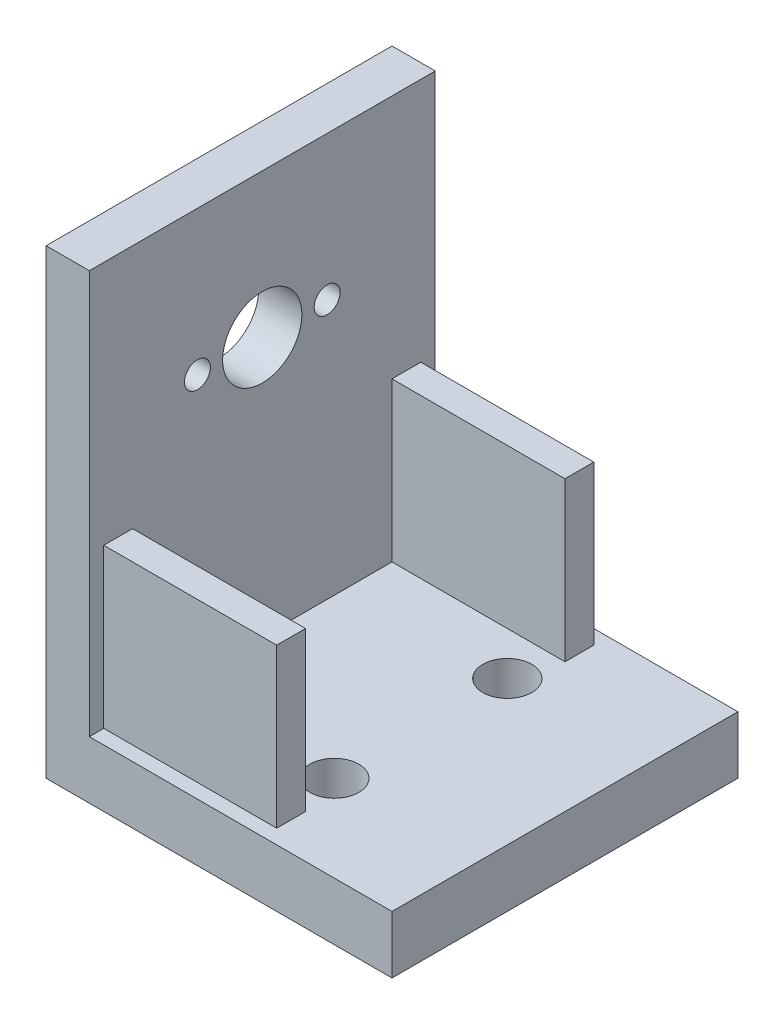
ISO-10303-21;
HEADER;
FILE_DESCRIPTION(('STEP AP214'),'2;1');
FILE_NAME('part.step','',(''),(''),'','','');
FILE_SCHEMA(('AUTOMOTIVE_DESIGN { 1 0 10303 214 1 1 1 1 }'));
ENDSEC;
DATA;
#1=APPLICATION_CONTEXT('core data for automotive mechanical design processes');
#2=APPLICATION_PROTOCOL_DEFINITION('international standard','automotive_design',2000,#1);
#3=PRODUCT_CONTEXT('',#1,'mechanical');
#4=PRODUCT('Part','Part','',(#3));
#5=PRODUCT_RELATED_PRODUCT_CATEGORY('part','',(#4));
#6=PRODUCT_DEFINITION_FORMATION('','',#4);
#7=PRODUCT_DEFINITION_CONTEXT('part definition',#1,'design');
#8=PRODUCT_DEFINITION('design','',#6,#7);
#9=PRODUCT_DEFINITION_SHAPE('','',#8);
#10=(LENGTH_UNIT() NAMED_UNIT(*) SI_UNIT(.MILLI.,.METRE.));
#11=(NAMED_UNIT(*) PLANE_ANGLE_UNIT() SI_UNIT($,.RADIAN.));
#12=(NAMED_UNIT(*) SI_UNIT($,.STERADIAN.) SOLID_ANGLE_UNIT());
#13=UNCERTAINTY_MEASURE_WITH_UNIT(LENGTH_MEASURE(1.E-05),#10,'distance_accuracy_value','');
#14=(GEOMETRIC_REPRESENTATION_CONTEXT(3) GLOBAL_UNCERTAINTY_ASSIGNED_CONTEXT((#13)) GLOBAL_UNIT_ASSIGNED_CONTEXT((#10,
#11,#12)) REPRESENTATION_CONTEXT('',''));
#15=CARTESIAN_POINT('',(0.,0.,0.));
#16=DIRECTION('',(0.,0.,1.));
#17=DIRECTION('',(1.,0.,0.));
#18=AXIS2_PLACEMENT_3D('',#15,#16,#17);
#19=CARTESIAN_POINT('',(0.,4.,0.));
#20=DIRECTION('',(0.,-1.,0.));
#21=DIRECTION('',(0.,0.,-1.));
#22=AXIS2_PLACEMENT_3D('',#19,#20,#21);
#23=PLANE('',#22);
#24=CARTESIAN_POINT('',(2.00000000000001,4.,6.));
#25=DIRECTION('',(0.,1.,0.));
#26=DIRECTION('',(0.,0.,1.));
#27=AXIS2_PLACEMENT_3D('',#24,#25,#26);
#28=CIRCLE('',#27,1.7);
#29=CARTESIAN_POINT('',(2.00000000000001,4.,7.7));
#30=VERTEX_POINT('',#29);
#31=EDGE_CURVE('E211',#30,#30,#28,.T.);
#32=ORIENTED_EDGE('',*,*,#31,.F.);
#33=EDGE_LOOP('',(#32));
#34=FACE_BOUND('',#33,.T.);
#35=CARTESIAN_POINT('',(2.00000000000001,4.,-6.));
#36=DIRECTION('',(0.,1.,0.));
#37=DIRECTION('',(0.,0.,1.));
#38=AXIS2_PLACEMENT_3D('',#35,#36,#37);
#39=CIRCLE('',#38,1.7);
#40=CARTESIAN_POINT('',(2.00000000000001,4.,-4.3));
#41=VERTEX_POINT('',#40);
#42=EDGE_CURVE('E212',#41,#41,#39,.T.);
#43=ORIENTED_EDGE('',*,*,#42,.F.);
#44=EDGE_LOOP('',(#43));
#45=FACE_BOUND('',#44,.T.);
#46=DIRECTION('',(-1.,0.,0.));
#47=VECTOR('',#46,1.);
#48=CARTESIAN_POINT('',(-9.,4.,9.));
#49=LINE('',#48,#47);
#50=CARTESIAN_POINT('',(3.,4.,9.));
#51=VERTEX_POINT('',#50);
#52=CARTESIAN_POINT('',(-9.,4.,8.99999999999999));
#53=VERTEX_POINT('',#52);
#54=EDGE_CURVE('E53',#51,#53,#49,.T.);
#55=ORIENTED_EDGE('',*,*,#54,.F.);
#56=DIRECTION('',(0.,0.,-1.));
#57=VECTOR('',#56,1.);
#58=CARTESIAN_POINT('',(3.,4.,11.));
#59=LINE('',#58,#57);
#60=CARTESIAN_POINT('',(3.,4.,11.));
#61=VERTEX_POINT('',#60);
#62=EDGE_CURVE('E59',#61,#51,#59,.T.);
#63=ORIENTED_EDGE('',*,*,#62,.F.);
#64=DIRECTION('',(1.,0.,0.));
#65=VECTOR('',#64,1.);
#66=CARTESIAN_POINT('',(-9.,4.,11.));
#67=LINE('',#66,#65);
#68=CARTESIAN_POINT('',(-9.,4.,11.));
#69=VERTEX_POINT('',#68);
#70=EDGE_CURVE('E166',#69,#61,#67,.T.);
#71=ORIENTED_EDGE('',*,*,#70,.F.);
#72=DIRECTION('',(0.,0.,-1.));
#73=VECTOR('',#72,1.);
#74=CARTESIAN_POINT('',(-9.,4.,-12.));
#75=LINE('',#74,#73);
#76=CARTESIAN_POINT('',(-9.,4.,12.));
#77=VERTEX_POINT('',#76);
#78=EDGE_CURVE('E148',#77,#69,#75,.T.);
#79=ORIENTED_EDGE('',*,*,#78,.F.);
#80=DIRECTION('',(1.,0.,0.));
#81=VECTOR('',#80,1.);
#82=CARTESIAN_POINT('',(-12.,4.,12.));
#83=LINE('',#82,#81);
#84=CARTESIAN_POINT('',(12.,4.,12.));
#85=VERTEX_POINT('',#84);
#86=EDGE_CURVE('E265',#77,#85,#83,.T.);
#87=ORIENTED_EDGE('',*,*,#86,.T.);
#88=DIRECTION('',(0.,0.,-1.));
#89=VECTOR('',#88,1.);
#90=CARTESIAN_POINT('',(12.,4.,12.));
#91=LINE('',#90,#89);
#92=CARTESIAN_POINT('',(12.,4.,-12.));
#93=VERTEX_POINT('',#92);
#94=EDGE_CURVE('E254',#85,#93,#91,.T.);
#95=ORIENTED_EDGE('',*,*,#94,.T.);
#96=DIRECTION('',(-1.,0.,0.));
#97=VECTOR('',#96,1.);
#98=CARTESIAN_POINT('',(-12.,4.,-12.));
#99=LINE('',#98,#97);
#100=CARTESIAN_POINT('',(-9.,4.,-12.));
#101=VERTEX_POINT('',#100);
#102=EDGE_CURVE('E256',#93,#101,#99,.T.);
#103=ORIENTED_EDGE('',*,*,#102,.T.);
#104=CARTESIAN_POINT('',(-9.,4.,-11.));
#105=VERTEX_POINT('',#104);
#106=EDGE_CURVE('E233',#105,#101,#75,.T.);
#107=ORIENTED_EDGE('',*,*,#106,.F.);
#108=DIRECTION('',(-1.,0.,0.));
#109=VECTOR('',#108,1.);
#110=CARTESIAN_POINT('',(-9.,4.,-11.));
#111=LINE('',#110,#109);
#112=CARTESIAN_POINT('',(3.,4.,-11.));
#113=VERTEX_POINT('',#112);
#114=EDGE_CURVE('E174',#113,#105,#111,.T.);
#115=ORIENTED_EDGE('',*,*,#114,.F.);
#116=DIRECTION('',(0.,0.,-1.));
#117=VECTOR('',#116,1.);
#118=CARTESIAN_POINT('',(3.,4.,-11.));
#119=LINE('',#118,#117);
#120=CARTESIAN_POINT('',(3.,4.,-9.));
#121=VERTEX_POINT('',#120);
#122=EDGE_CURVE('E187',#121,#113,#119,.T.);
#123=ORIENTED_EDGE('',*,*,#122,.F.);
#124=DIRECTION('',(1.,0.,0.));
#125=VECTOR('',#124,1.);
#126=CARTESIAN_POINT('',(-9.,4.,-9.));
#127=LINE('',#126,#125);
#128=CARTESIAN_POINT('',(-9.,4.,-9.));
#129=VERTEX_POINT('',#128);
#130=EDGE_CURVE('E192',#129,#121,#127,.T.);
#131=ORIENTED_EDGE('',*,*,#130,.F.);
#132=EDGE_CURVE('E248',#53,#129,#75,.T.);
#133=ORIENTED_EDGE('',*,*,#132,.F.);
#134=EDGE_LOOP('',(#55,#63,#71,#79,#87,#95,#103,#107,#115,#123,#131,#133));
#135=FACE_BOUND('',#134,.T.);
#136=ADVANCED_FACE('F39',(#34,#45,#135),#23,.F.);
#137=CARTESIAN_POINT('',(-9.,32.,-12.));
#138=DIRECTION('',(-1.,0.,0.));
#139=DIRECTION('',(0.,0.,1.));
#140=AXIS2_PLACEMENT_3D('',#137,#138,#139);
#141=PLANE('',#140);
#142=CARTESIAN_POINT('',(-9.,22.,4.5));
#143=DIRECTION('',(1.,0.,0.));
#144=DIRECTION('',(0.,0.,-1.));
#145=AXIS2_PLACEMENT_3D('',#142,#143,#144);
#146=CIRCLE('',#145,0.9);
#147=CARTESIAN_POINT('',(-9.,22.,3.6));
#148=VERTEX_POINT('',#147);
#149=EDGE_CURVE('E229',#148,#148,#146,.T.);
#150=ORIENTED_EDGE('',*,*,#149,.F.);
#151=EDGE_LOOP('',(#150));
#152=FACE_BOUND('',#151,.T.);
#153=CARTESIAN_POINT('',(-9.,22.,-4.5));
#154=DIRECTION('',(1.,0.,0.));
#155=DIRECTION('',(0.,0.,-1.));
#156=AXIS2_PLACEMENT_3D('',#153,#154,#155);
#157=CIRCLE('',#156,0.900000000000001);
#158=CARTESIAN_POINT('',(-9.,22.,-5.4));
#159=VERTEX_POINT('',#158);
#160=EDGE_CURVE('E218',#159,#159,#157,.T.);
#161=ORIENTED_EDGE('',*,*,#160,.F.);
#162=EDGE_LOOP('',(#161));
#163=FACE_BOUND('',#162,.T.);
#164=CARTESIAN_POINT('',(-9.,22.,0.));
#165=DIRECTION('',(1.,0.,0.));
#166=DIRECTION('',(0.,0.,-1.));
#167=AXIS2_PLACEMENT_3D('',#164,#165,#166);
#168=CIRCLE('',#167,2.75);
#169=CARTESIAN_POINT('',(-9.,22.,-2.75));
#170=VERTEX_POINT('',#169);
#171=EDGE_CURVE('E225',#170,#170,#168,.T.);
#172=ORIENTED_EDGE('',*,*,#171,.F.);
#173=EDGE_LOOP('',(#172));
#174=FACE_BOUND('',#173,.T.);
#175=DIRECTION('',(0.,-1.,0.));
#176=VECTOR('',#175,1.);
#177=CARTESIAN_POINT('',(-9.,15.,11.));
#178=LINE('',#177,#176);
#179=CARTESIAN_POINT('',(-9.,15.,11.));
#180=VERTEX_POINT('',#179);
#181=EDGE_CURVE('E138',#180,#69,#178,.T.);
#182=ORIENTED_EDGE('',*,*,#181,.F.);
#183=DIRECTION('',(0.,0.,1.));
#184=VECTOR('',#183,1.);
#185=CARTESIAN_POINT('',(-9.,15.,11.));
#186=LINE('',#185,#184);
#187=CARTESIAN_POINT('',(-9.,15.,9.));
#188=VERTEX_POINT('',#187);
#189=EDGE_CURVE('E141',#188,#180,#186,.T.);
#190=ORIENTED_EDGE('',*,*,#189,.F.);
#191=DIRECTION('',(0.,-1.,0.));
#192=VECTOR('',#191,1.);
#193=CARTESIAN_POINT('',(-9.,15.,9.));
#194=LINE('',#193,#192);
#195=EDGE_CURVE('E169',#188,#53,#194,.T.);
#196=ORIENTED_EDGE('',*,*,#195,.T.);
#197=ORIENTED_EDGE('',*,*,#132,.T.);
#198=DIRECTION('',(0.,-1.,0.));
#199=VECTOR('',#198,1.);
#200=CARTESIAN_POINT('',(-9.,15.,-9.));
#201=LINE('',#200,#199);
#202=CARTESIAN_POINT('',(-9.,15.,-9.));
#203=VERTEX_POINT('',#202);
#204=EDGE_CURVE('E179',#203,#129,#201,.T.);
#205=ORIENTED_EDGE('',*,*,#204,.F.);
#206=DIRECTION('',(0.,0.,1.));
#207=VECTOR('',#206,1.);
#208=CARTESIAN_POINT('',(-9.,15.,-11.));
#209=LINE('',#208,#207);
#210=CARTESIAN_POINT('',(-9.,15.,-11.));
#211=VERTEX_POINT('',#210);
#212=EDGE_CURVE('E205',#211,#203,#209,.T.);
#213=ORIENTED_EDGE('',*,*,#212,.F.);
#214=DIRECTION('',(0.,-1.,0.));
#215=VECTOR('',#214,1.);
#216=CARTESIAN_POINT('',(-9.,15.,-11.));
#217=LINE('',#216,#215);
#218=EDGE_CURVE('E177',#211,#105,#217,.T.);
#219=ORIENTED_EDGE('',*,*,#218,.T.);
#220=ORIENTED_EDGE('',*,*,#106,.T.);
#221=DIRECTION('',(0.,-1.,0.));
#222=VECTOR('',#221,1.);
#223=CARTESIAN_POINT('',(-9.,32.,-12.));
#224=LINE('',#223,#222);
#225=CARTESIAN_POINT('',(-9.,32.,-12.));
#226=VERTEX_POINT('',#225);
#227=EDGE_CURVE('E250',#226,#101,#224,.T.);
#228=ORIENTED_EDGE('',*,*,#227,.F.);
#229=DIRECTION('',(0.,0.,-1.));
#230=VECTOR('',#229,1.);
#231=CARTESIAN_POINT('',(-9.,32.,-12.));
#232=LINE('',#231,#230);
#233=CARTESIAN_POINT('',(-9.,32.,12.));
#234=VERTEX_POINT('',#233);
#235=EDGE_CURVE('E241',#234,#226,#232,.T.);
#236=ORIENTED_EDGE('',*,*,#235,.F.);
#237=DIRECTION('',(0.,-1.,0.));
#238=VECTOR('',#237,1.);
#239=CARTESIAN_POINT('',(-9.,32.,12.));
#240=LINE('',#239,#238);
#241=EDGE_CURVE('E252',#234,#77,#240,.T.);
#242=ORIENTED_EDGE('',*,*,#241,.T.);
#243=ORIENTED_EDGE('',*,*,#78,.T.);
#244=EDGE_LOOP('',(#182,#190,#196,#197,#205,#213,#219,#220,#228,#236,#242,#243));
#245=FACE_BOUND('',#244,.T.);
#246=ADVANCED_FACE('F143',(#152,#163,#174,#245),#141,.F.);
#247=CARTESIAN_POINT('',(12.,4.,12.));
#248=DIRECTION('',(-1.,0.,0.));
#249=DIRECTION('',(0.,0.,1.));
#250=AXIS2_PLACEMENT_3D('',#247,#248,#249);
#251=PLANE('',#250);
#252=DIRECTION('',(0.,0.,-1.));
#253=VECTOR('',#252,1.);
#254=CARTESIAN_POINT('',(12.,0.,12.));
#255=LINE('',#254,#253);
#256=CARTESIAN_POINT('',(12.,0.,12.));
#257=VERTEX_POINT('',#256);
#258=CARTESIAN_POINT('',(12.,0.,-12.));
#259=VERTEX_POINT('',#258);
#260=EDGE_CURVE('E255',#257,#259,#255,.T.);
#261=ORIENTED_EDGE('',*,*,#260,.T.);
#262=DIRECTION('',(0.,-1.,0.));
#263=VECTOR('',#262,1.);
#264=CARTESIAN_POINT('',(12.,4.,-12.));
#265=LINE('',#264,#263);
#266=EDGE_CURVE('E11',#93,#259,#265,.T.);
#267=ORIENTED_EDGE('',*,*,#266,.F.);
#268=ORIENTED_EDGE('',*,*,#94,.F.);
#269=DIRECTION('',(0.,-1.,0.));
#270=VECTOR('',#269,1.);
#271=CARTESIAN_POINT('',(12.,4.,12.));
#272=LINE('',#271,#270);
#273=EDGE_CURVE('E262',#85,#257,#272,.T.);
#274=ORIENTED_EDGE('',*,*,#273,.T.);
#275=EDGE_LOOP('',(#261,#267,#268,#274));
#276=FACE_BOUND('',#275,.T.);
#277=ADVANCED_FACE('F41',(#276),#251,.F.);
#278=CARTESIAN_POINT('',(-12.,4.,-12.));
#279=DIRECTION('',(0.,0.,1.));
#280=DIRECTION('',(1.,0.,0.));
#281=AXIS2_PLACEMENT_3D('',#278,#279,#280);
#282=PLANE('',#281);
#283=DIRECTION('',(-1.,0.,0.));
#284=VECTOR('',#283,1.);
#285=CARTESIAN_POINT('',(-12.,0.,-12.));
#286=LINE('',#285,#284);
#287=CARTESIAN_POINT('',(-12.,0.,-12.));
#288=VERTEX_POINT('',#287);
#289=EDGE_CURVE('E270',#259,#288,#286,.T.);
#290=ORIENTED_EDGE('',*,*,#289,.T.);
#291=DIRECTION('',(0.,-1.,0.));
#292=VECTOR('',#291,1.);
#293=CARTESIAN_POINT('',(-12.,4.,-12.));
#294=LINE('',#293,#292);
#295=CARTESIAN_POINT('',(-12.,32.,-12.));
#296=VERTEX_POINT('',#295);
#297=EDGE_CURVE('E50',#296,#288,#294,.T.);
#298=ORIENTED_EDGE('',*,*,#297,.F.);
#299=DIRECTION('',(-1.,0.,0.));
#300=VECTOR('',#299,1.);
#301=CARTESIAN_POINT('',(-12.,32.,-12.));
#302=LINE('',#301,#300);
#303=EDGE_CURVE('E243',#226,#296,#302,.T.);
#304=ORIENTED_EDGE('',*,*,#303,.F.);
#305=ORIENTED_EDGE('',*,*,#227,.T.);
#306=ORIENTED_EDGE('',*,*,#102,.F.);
#307=ORIENTED_EDGE('',*,*,#266,.T.);
#308=EDGE_LOOP('',(#290,#298,#304,#305,#306,#307));
#309=FACE_BOUND('',#308,.T.);
#310=ADVANCED_FACE('F301',(#309),#282,.F.);
#311=CARTESIAN_POINT('',(-12.,4.,12.));
#312=DIRECTION('',(1.,0.,0.));
#313=DIRECTION('',(0.,0.,-1.));
#314=AXIS2_PLACEMENT_3D('',#311,#312,#313);
#315=PLANE('',#314);
#316=CARTESIAN_POINT('',(-12.,22.,4.5));
#317=DIRECTION('',(1.,0.,0.));
#318=DIRECTION('',(0.,0.,-1.));
#319=AXIS2_PLACEMENT_3D('',#316,#317,#318);
#320=CIRCLE('',#319,0.9);
#321=CARTESIAN_POINT('',(-12.,22.,3.6));
#322=VERTEX_POINT('',#321);
#323=EDGE_CURVE('E209',#322,#322,#320,.T.);
#324=ORIENTED_EDGE('',*,*,#323,.T.);
#325=EDGE_LOOP('',(#324));
#326=FACE_BOUND('',#325,.T.);
#327=CARTESIAN_POINT('',(-12.,22.,-4.5));
#328=DIRECTION('',(1.,0.,0.));
#329=DIRECTION('',(0.,0.,-1.));
#330=AXIS2_PLACEMENT_3D('',#327,#328,#329);
#331=CIRCLE('',#330,0.900000000000001);
#332=CARTESIAN_POINT('',(-12.,22.,-5.4));
#333=VERTEX_POINT('',#332);
#334=EDGE_CURVE('E224',#333,#333,#331,.T.);
#335=ORIENTED_EDGE('',*,*,#334,.T.);
#336=EDGE_LOOP('',(#335));
#337=FACE_BOUND('',#336,.T.);
#338=CARTESIAN_POINT('',(-12.,22.,0.));
#339=DIRECTION('',(1.,0.,0.));
#340=DIRECTION('',(0.,0.,-1.));
#341=AXIS2_PLACEMENT_3D('',#338,#339,#340);
#342=CIRCLE('',#341,2.75);
#343=CARTESIAN_POINT('',(-12.,22.,-2.75));
#344=VERTEX_POINT('',#343);
#345=EDGE_CURVE('E231',#344,#344,#342,.T.);
#346=ORIENTED_EDGE('',*,*,#345,.T.);
#347=EDGE_LOOP('',(#346));
#348=FACE_BOUND('',#347,.T.);
#349=DIRECTION('',(0.,0.,1.));
#350=VECTOR('',#349,1.);
#351=CARTESIAN_POINT('',(-12.,0.,12.));
#352=LINE('',#351,#350);
#353=CARTESIAN_POINT('',(-12.,0.,12.));
#354=VERTEX_POINT('',#353);
#355=EDGE_CURVE('E267',#288,#354,#352,.T.);
#356=ORIENTED_EDGE('',*,*,#355,.T.);
#357=DIRECTION('',(0.,-1.,0.));
#358=VECTOR('',#357,1.);
#359=CARTESIAN_POINT('',(-12.,4.,12.));
#360=LINE('',#359,#358);
#361=CARTESIAN_POINT('',(-12.,32.,12.));
#362=VERTEX_POINT('',#361);
#363=EDGE_CURVE('E273',#362,#354,#360,.T.);
#364=ORIENTED_EDGE('',*,*,#363,.F.);
#365=DIRECTION('',(0.,0.,1.));
#366=VECTOR('',#365,1.);
#367=CARTESIAN_POINT('',(-12.,32.,-12.));
#368=LINE('',#367,#366);
#369=EDGE_CURVE('E240',#296,#362,#368,.T.);
#370=ORIENTED_EDGE('',*,*,#369,.F.);
#371=ORIENTED_EDGE('',*,*,#297,.T.);
#372=EDGE_LOOP('',(#356,#364,#370,#371));
#373=FACE_BOUND('',#372,.T.);
#374=ADVANCED_FACE('F278',(#326,#337,#348,#373),#315,.F.);
#375=CARTESIAN_POINT('',(-12.,4.,12.));
#376=DIRECTION('',(0.,0.,-1.));
#377=DIRECTION('',(-1.,0.,0.));
#378=AXIS2_PLACEMENT_3D('',#375,#376,#377);
#379=PLANE('',#378);
#380=DIRECTION('',(1.,0.,0.));
#381=VECTOR('',#380,1.);
#382=CARTESIAN_POINT('',(-12.,0.,12.));
#383=LINE('',#382,#381);
#384=EDGE_CURVE('E259',#354,#257,#383,.T.);
#385=ORIENTED_EDGE('',*,*,#384,.T.);
#386=ORIENTED_EDGE('',*,*,#273,.F.);
#387=ORIENTED_EDGE('',*,*,#86,.F.);
#388=ORIENTED_EDGE('',*,*,#241,.F.);
#389=DIRECTION('',(1.,0.,0.));
#390=VECTOR('',#389,1.);
#391=CARTESIAN_POINT('',(-12.,32.,12.));
#392=LINE('',#391,#390);
#393=EDGE_CURVE('E238',#362,#234,#392,.T.);
#394=ORIENTED_EDGE('',*,*,#393,.F.);
#395=ORIENTED_EDGE('',*,*,#363,.T.);
#396=EDGE_LOOP('',(#385,#386,#387,#388,#394,#395));
#397=FACE_BOUND('',#396,.T.);
#398=ADVANCED_FACE('F288',(#397),#379,.F.);
#399=CARTESIAN_POINT('',(0.,0.,0.));
#400=DIRECTION('',(0.,-1.,0.));
#401=DIRECTION('',(0.,0.,-1.));
#402=AXIS2_PLACEMENT_3D('',#399,#400,#401);
#403=PLANE('',#402);
#404=CARTESIAN_POINT('',(2.00000000000001,0.,6.));
#405=DIRECTION('',(0.,1.,0.));
#406=DIRECTION('',(0.,0.,1.));
#407=AXIS2_PLACEMENT_3D('',#404,#405,#406);
#408=CIRCLE('',#407,1.7);
#409=CARTESIAN_POINT('',(2.00000000000001,0.,7.7));
#410=VERTEX_POINT('',#409);
#411=EDGE_CURVE('E210',#410,#410,#408,.T.);
#412=ORIENTED_EDGE('',*,*,#411,.T.);
#413=EDGE_LOOP('',(#412));
#414=FACE_BOUND('',#413,.T.);
#415=CARTESIAN_POINT('',(2.00000000000001,0.,-6.));
#416=DIRECTION('',(0.,1.,0.));
#417=DIRECTION('',(0.,0.,1.));
#418=AXIS2_PLACEMENT_3D('',#415,#416,#417);
#419=CIRCLE('',#418,1.7);
#420=CARTESIAN_POINT('',(2.00000000000001,0.,-4.3));
#421=VERTEX_POINT('',#420);
#422=EDGE_CURVE('E146',#421,#421,#419,.T.);
#423=ORIENTED_EDGE('',*,*,#422,.T.);
#424=EDGE_LOOP('',(#423));
#425=FACE_BOUND('',#424,.T.);
#426=ORIENTED_EDGE('',*,*,#260,.F.);
#427=ORIENTED_EDGE('',*,*,#384,.F.);
#428=ORIENTED_EDGE('',*,*,#355,.F.);
#429=ORIENTED_EDGE('',*,*,#289,.F.);
#430=EDGE_LOOP('',(#426,#427,#428,#429));
#431=FACE_BOUND('',#430,.T.);
#432=ADVANCED_FACE('F286',(#414,#425,#431),#403,.T.);
#433=CARTESIAN_POINT('',(0.,32.,0.));
#434=DIRECTION('',(0.,1.,0.));
#435=DIRECTION('',(0.,0.,1.));
#436=AXIS2_PLACEMENT_3D('',#433,#434,#435);
#437=PLANE('',#436);
#438=ORIENTED_EDGE('',*,*,#369,.T.);
#439=ORIENTED_EDGE('',*,*,#393,.T.);
#440=ORIENTED_EDGE('',*,*,#235,.T.);
#441=ORIENTED_EDGE('',*,*,#303,.T.);
#442=EDGE_LOOP('',(#438,#439,#440,#441));
#443=FACE_BOUND('',#442,.T.);
#444=ADVANCED_FACE('F297',(#443),#437,.T.);
#445=CARTESIAN_POINT('',(-12.,22.,0.));
#446=DIRECTION('',(1.,0.,0.));
#447=DIRECTION('',(0.,0.,-1.));
#448=AXIS2_PLACEMENT_3D('',#445,#446,#447);
#449=CYLINDRICAL_SURFACE('',#448,2.75);
#450=ORIENTED_EDGE('',*,*,#345,.F.);
#451=EDGE_LOOP('',(#450));
#452=FACE_BOUND('',#451,.T.);
#453=ORIENTED_EDGE('',*,*,#171,.T.);
#454=EDGE_LOOP('',(#453));
#455=FACE_BOUND('',#454,.T.);
#456=ADVANCED_FACE('F333',(#452,#455),#449,.F.);
#457=CARTESIAN_POINT('',(-12.,22.,-4.5));
#458=DIRECTION('',(1.,0.,0.));
#459=DIRECTION('',(0.,0.,-1.));
#460=AXIS2_PLACEMENT_3D('',#457,#458,#459);
#461=CYLINDRICAL_SURFACE('',#460,0.900000000000001);
#462=ORIENTED_EDGE('',*,*,#334,.F.);
#463=EDGE_LOOP('',(#462));
#464=FACE_BOUND('',#463,.T.);
#465=ORIENTED_EDGE('',*,*,#160,.T.);
#466=EDGE_LOOP('',(#465));
#467=FACE_BOUND('',#466,.T.);
#468=ADVANCED_FACE('F350',(#464,#467),#461,.F.);
#469=CARTESIAN_POINT('',(-12.,22.,4.5));
#470=DIRECTION('',(1.,0.,0.));
#471=DIRECTION('',(0.,0.,-1.));
#472=AXIS2_PLACEMENT_3D('',#469,#470,#471);
#473=CYLINDRICAL_SURFACE('',#472,0.9);
#474=ORIENTED_EDGE('',*,*,#323,.F.);
#475=EDGE_LOOP('',(#474));
#476=FACE_BOUND('',#475,.T.);
#477=ORIENTED_EDGE('',*,*,#149,.T.);
#478=EDGE_LOOP('',(#477));
#479=FACE_BOUND('',#478,.T.);
#480=ADVANCED_FACE('F356',(#476,#479),#473,.F.);
#481=CARTESIAN_POINT('',(2.00000000000001,0.,-6.));
#482=DIRECTION('',(0.,1.,0.));
#483=DIRECTION('',(0.,0.,1.));
#484=AXIS2_PLACEMENT_3D('',#481,#482,#483);
#485=CYLINDRICAL_SURFACE('',#484,1.7);
#486=ORIENTED_EDGE('',*,*,#422,.F.);
#487=EDGE_LOOP('',(#486));
#488=FACE_BOUND('',#487,.T.);
#489=ORIENTED_EDGE('',*,*,#42,.T.);
#490=EDGE_LOOP('',(#489));
#491=FACE_BOUND('',#490,.T.);
#492=ADVANCED_FACE('F365',(#488,#491),#485,.F.);
#493=CARTESIAN_POINT('',(2.00000000000001,0.,6.));
#494=DIRECTION('',(0.,1.,0.));
#495=DIRECTION('',(0.,0.,1.));
#496=AXIS2_PLACEMENT_3D('',#493,#494,#495);
#497=CYLINDRICAL_SURFACE('',#496,1.7);
#498=ORIENTED_EDGE('',*,*,#411,.F.);
#499=EDGE_LOOP('',(#498));
#500=FACE_BOUND('',#499,.T.);
#501=ORIENTED_EDGE('',*,*,#31,.T.);
#502=EDGE_LOOP('',(#501));
#503=FACE_BOUND('',#502,.T.);
#504=ADVANCED_FACE('F378',(#500,#503),#497,.F.);
#505=CARTESIAN_POINT('',(-9.,15.,-11.));
#506=DIRECTION('',(0.,0.,1.));
#507=DIRECTION('',(1.,0.,0.));
#508=AXIS2_PLACEMENT_3D('',#505,#506,#507);
#509=PLANE('',#508);
#510=ORIENTED_EDGE('',*,*,#114,.T.);
#511=ORIENTED_EDGE('',*,*,#218,.F.);
#512=DIRECTION('',(-1.,0.,0.));
#513=VECTOR('',#512,1.);
#514=CARTESIAN_POINT('',(-9.,15.,-11.));
#515=LINE('',#514,#513);
#516=CARTESIAN_POINT('',(3.,15.,-11.));
#517=VERTEX_POINT('',#516);
#518=EDGE_CURVE('E193',#517,#211,#515,.T.);
#519=ORIENTED_EDGE('',*,*,#518,.F.);
#520=DIRECTION('',(0.,-1.,0.));
#521=VECTOR('',#520,1.);
#522=CARTESIAN_POINT('',(3.,15.,-11.));
#523=LINE('',#522,#521);
#524=EDGE_CURVE('E189',#517,#113,#523,.T.);
#525=ORIENTED_EDGE('',*,*,#524,.T.);
#526=EDGE_LOOP('',(#510,#511,#519,#525));
#527=FACE_BOUND('',#526,.T.);
#528=ADVANCED_FACE('F387',(#527),#509,.F.);
#529=CARTESIAN_POINT('',(-9.,15.,-9.));
#530=DIRECTION('',(0.,0.,-1.));
#531=DIRECTION('',(-1.,0.,0.));
#532=AXIS2_PLACEMENT_3D('',#529,#530,#531);
#533=PLANE('',#532);
#534=ORIENTED_EDGE('',*,*,#130,.T.);
#535=DIRECTION('',(0.,-1.,0.));
#536=VECTOR('',#535,1.);
#537=CARTESIAN_POINT('',(3.,15.,-9.));
#538=LINE('',#537,#536);
#539=CARTESIAN_POINT('',(3.,15.,-9.));
#540=VERTEX_POINT('',#539);
#541=EDGE_CURVE('E181',#540,#121,#538,.T.);
#542=ORIENTED_EDGE('',*,*,#541,.F.);
#543=DIRECTION('',(1.,0.,0.));
#544=VECTOR('',#543,1.);
#545=CARTESIAN_POINT('',(-9.,15.,-9.));
#546=LINE('',#545,#544);
#547=EDGE_CURVE('E199',#203,#540,#546,.T.);
#548=ORIENTED_EDGE('',*,*,#547,.F.);
#549=ORIENTED_EDGE('',*,*,#204,.T.);
#550=EDGE_LOOP('',(#534,#542,#548,#549));
#551=FACE_BOUND('',#550,.T.);
#552=ADVANCED_FACE('F408',(#551),#533,.F.);
#553=CARTESIAN_POINT('',(3.,15.,-11.));
#554=DIRECTION('',(-1.,0.,0.));
#555=DIRECTION('',(0.,0.,1.));
#556=AXIS2_PLACEMENT_3D('',#553,#554,#555);
#557=PLANE('',#556);
#558=ORIENTED_EDGE('',*,*,#122,.T.);
#559=ORIENTED_EDGE('',*,*,#524,.F.);
#560=DIRECTION('',(0.,0.,-1.));
#561=VECTOR('',#560,1.);
#562=CARTESIAN_POINT('',(3.,15.,-11.));
#563=LINE('',#562,#561);
#564=EDGE_CURVE('E188',#540,#517,#563,.T.);
#565=ORIENTED_EDGE('',*,*,#564,.F.);
#566=ORIENTED_EDGE('',*,*,#541,.T.);
#567=EDGE_LOOP('',(#558,#559,#565,#566));
#568=FACE_BOUND('',#567,.T.);
#569=ADVANCED_FACE('F420',(#568),#557,.F.);
#570=CARTESIAN_POINT('',(0.,15.,0.));
#571=DIRECTION('',(0.,-1.,0.));
#572=DIRECTION('',(0.,0.,-1.));
#573=AXIS2_PLACEMENT_3D('',#570,#571,#572);
#574=PLANE('',#573);
#575=ORIENTED_EDGE('',*,*,#518,.T.);
#576=ORIENTED_EDGE('',*,*,#212,.T.);
#577=ORIENTED_EDGE('',*,*,#547,.T.);
#578=ORIENTED_EDGE('',*,*,#564,.T.);
#579=EDGE_LOOP('',(#575,#576,#577,#578));
#580=FACE_BOUND('',#579,.T.);
#581=ADVANCED_FACE('F427',(#580),#574,.F.);
#582=CARTESIAN_POINT('',(-9.,15.,11.));
#583=DIRECTION('',(0.,0.,-1.));
#584=DIRECTION('',(-1.,0.,0.));
#585=AXIS2_PLACEMENT_3D('',#582,#583,#584);
#586=PLANE('',#585);
#587=ORIENTED_EDGE('',*,*,#70,.T.);
#588=DIRECTION('',(0.,-1.,0.));
#589=VECTOR('',#588,1.);
#590=CARTESIAN_POINT('',(3.,15.,11.));
#591=LINE('',#590,#589);
#592=CARTESIAN_POINT('',(3.,15.,11.));
#593=VERTEX_POINT('',#592);
#594=EDGE_CURVE('E149',#593,#61,#591,.T.);
#595=ORIENTED_EDGE('',*,*,#594,.F.);
#596=DIRECTION('',(1.,0.,0.));
#597=VECTOR('',#596,1.);
#598=CARTESIAN_POINT('',(-9.,15.,11.));
#599=LINE('',#598,#597);
#600=EDGE_CURVE('E155',#180,#593,#599,.T.);
#601=ORIENTED_EDGE('',*,*,#600,.F.);
#602=ORIENTED_EDGE('',*,*,#181,.T.);
#603=EDGE_LOOP('',(#587,#595,#601,#602));
#604=FACE_BOUND('',#603,.T.);
#605=ADVANCED_FACE('F153',(#604),#586,.F.);
#606=CARTESIAN_POINT('',(3.,15.,11.));
#607=DIRECTION('',(-1.,0.,0.));
#608=DIRECTION('',(0.,0.,1.));
#609=AXIS2_PLACEMENT_3D('',#606,#607,#608);
#610=PLANE('',#609);
#611=ORIENTED_EDGE('',*,*,#62,.T.);
#612=DIRECTION('',(0.,-1.,0.));
#613=VECTOR('',#612,1.);
#614=CARTESIAN_POINT('',(3.,15.,9.));
#615=LINE('',#614,#613);
#616=CARTESIAN_POINT('',(3.,15.,9.));
#617=VERTEX_POINT('',#616);
#618=EDGE_CURVE('E173',#617,#51,#615,.T.);
#619=ORIENTED_EDGE('',*,*,#618,.F.);
#620=DIRECTION('',(0.,0.,-1.));
#621=VECTOR('',#620,1.);
#622=CARTESIAN_POINT('',(3.,15.,11.));
#623=LINE('',#622,#621);
#624=EDGE_CURVE('E160',#593,#617,#623,.T.);
#625=ORIENTED_EDGE('',*,*,#624,.F.);
#626=ORIENTED_EDGE('',*,*,#594,.T.);
#627=EDGE_LOOP('',(#611,#619,#625,#626));
#628=FACE_BOUND('',#627,.T.);
#629=ADVANCED_FACE('F450',(#628),#610,.F.);
#630=CARTESIAN_POINT('',(-9.,15.,9.));
#631=DIRECTION('',(0.,0.,1.));
#632=DIRECTION('',(1.,0.,0.));
#633=AXIS2_PLACEMENT_3D('',#630,#631,#632);
#634=PLANE('',#633);
#635=ORIENTED_EDGE('',*,*,#54,.T.);
#636=ORIENTED_EDGE('',*,*,#195,.F.);
#637=DIRECTION('',(-1.,0.,0.));
#638=VECTOR('',#637,1.);
#639=CARTESIAN_POINT('',(-9.,15.,9.));
#640=LINE('',#639,#638);
#641=EDGE_CURVE('E161',#617,#188,#640,.T.);
#642=ORIENTED_EDGE('',*,*,#641,.F.);
#643=ORIENTED_EDGE('',*,*,#618,.T.);
#644=EDGE_LOOP('',(#635,#636,#642,#643));
#645=FACE_BOUND('',#644,.T.);
#646=ADVANCED_FACE('F460',(#645),#634,.F.);
#647=CARTESIAN_POINT('',(0.,15.,0.));
#648=DIRECTION('',(0.,-1.,0.));
#649=DIRECTION('',(0.,0.,-1.));
#650=AXIS2_PLACEMENT_3D('',#647,#648,#649);
#651=PLANE('',#650);
#652=ORIENTED_EDGE('',*,*,#189,.T.);
#653=ORIENTED_EDGE('',*,*,#600,.T.);
#654=ORIENTED_EDGE('',*,*,#624,.T.);
#655=ORIENTED_EDGE('',*,*,#641,.T.);
#656=EDGE_LOOP('',(#652,#653,#654,#655));
#657=FACE_BOUND('',#656,.T.);
#658=ADVANCED_FACE('F157',(#657),#651,.F.);
#659=CLOSED_SHELL('',(#136,#246,#277,#310,#374,#398,#432,#444,#456,#468,#480,#492,#504,#528,
#552,#569,#581,#605,#629,#646,#658));
#660=MANIFOLD_SOLID_BREP('B2',#659);
#661=ADVANCED_BREP_SHAPE_REPRESENTATION('',(#18,#660),#14);
#662=SHAPE_DEFINITION_REPRESENTATION(#9,#661);
ENDSEC;
END-ISO-10303-21;
